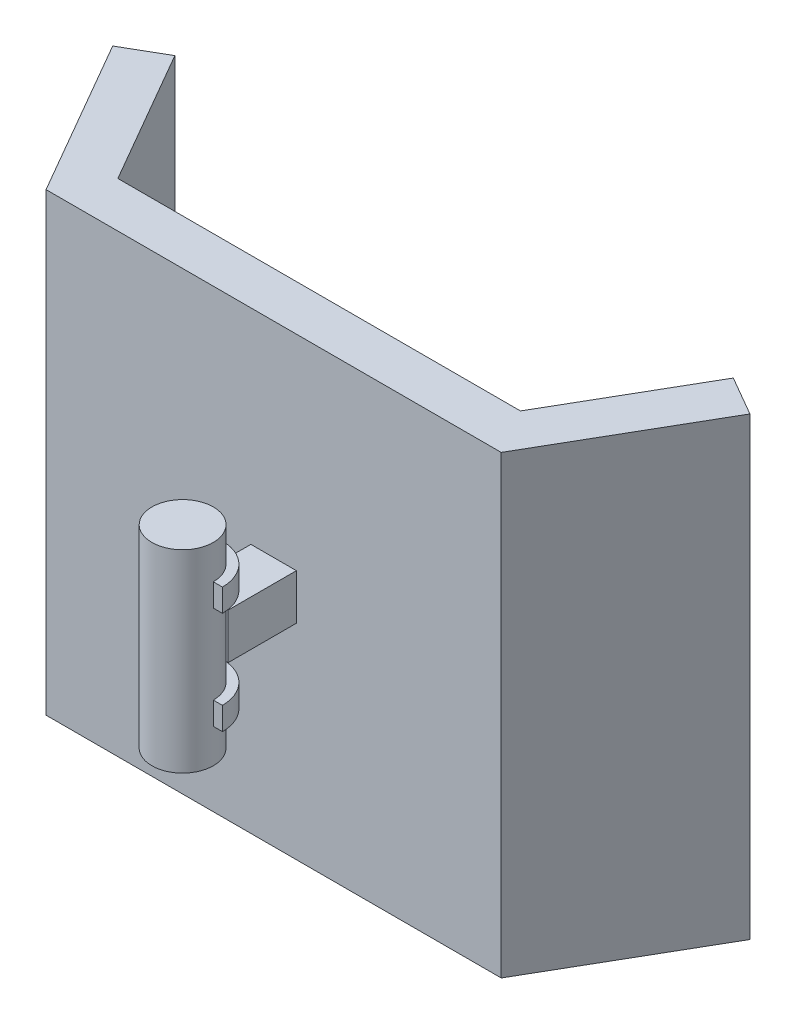
ISO-10303-21;
HEADER;
FILE_DESCRIPTION(('STEP AP214'),'2;1');
FILE_NAME('part.step','',(''),(''),'','','');
FILE_SCHEMA(('AUTOMOTIVE_DESIGN { 1 0 10303 214 1 1 1 1 }'));
ENDSEC;
DATA;
#1=APPLICATION_CONTEXT('core data for automotive mechanical design processes');
#2=APPLICATION_PROTOCOL_DEFINITION('international standard','automotive_design',2000,#1);
#3=PRODUCT_CONTEXT('',#1,'mechanical');
#4=PRODUCT('Part','Part','',(#3));
#5=PRODUCT_RELATED_PRODUCT_CATEGORY('part','',(#4));
#6=PRODUCT_DEFINITION_FORMATION('','',#4);
#7=PRODUCT_DEFINITION_CONTEXT('part definition',#1,'design');
#8=PRODUCT_DEFINITION('design','',#6,#7);
#9=PRODUCT_DEFINITION_SHAPE('','',#8);
#10=(LENGTH_UNIT() NAMED_UNIT(*) SI_UNIT(.MILLI.,.METRE.));
#11=(NAMED_UNIT(*) PLANE_ANGLE_UNIT() SI_UNIT($,.RADIAN.));
#12=(NAMED_UNIT(*) SI_UNIT($,.STERADIAN.) SOLID_ANGLE_UNIT());
#13=UNCERTAINTY_MEASURE_WITH_UNIT(LENGTH_MEASURE(1.E-05),#10,'distance_accuracy_value','');
#14=(GEOMETRIC_REPRESENTATION_CONTEXT(3) GLOBAL_UNCERTAINTY_ASSIGNED_CONTEXT((#13)) GLOBAL_UNIT_ASSIGNED_CONTEXT((#10,
#11,#12)) REPRESENTATION_CONTEXT('',''));
#15=CARTESIAN_POINT('',(0.,0.,0.));
#16=DIRECTION('',(0.,0.,1.));
#17=DIRECTION('',(1.,0.,0.));
#18=AXIS2_PLACEMENT_3D('',#15,#16,#17);
#19=CARTESIAN_POINT('',(0.,-4.25,4.));
#20=DIRECTION('',(0.,1.,0.));
#21=DIRECTION('',(0.,0.,1.));
#22=AXIS2_PLACEMENT_3D('',#19,#20,#21);
#23=CYLINDRICAL_SURFACE('',#22,1.35);
#24=CARTESIAN_POINT('',(0.,4.25,4.));
#25=DIRECTION('',(0.,1.,0.));
#26=DIRECTION('',(0.,0.,1.));
#27=AXIS2_PLACEMENT_3D('',#24,#25,#26);
#28=CIRCLE('',#27,1.35);
#29=CARTESIAN_POINT('',(0.,4.25,5.35));
#30=VERTEX_POINT('',#29);
#31=EDGE_CURVE('E296',#30,#30,#28,.T.);
#32=ORIENTED_EDGE('',*,*,#31,.F.);
#33=EDGE_LOOP('',(#32));
#34=FACE_BOUND('',#33,.T.);
#35=CARTESIAN_POINT('',(0.,-4.25,4.));
#36=DIRECTION('',(0.,1.,0.));
#37=DIRECTION('',(0.,0.,1.));
#38=AXIS2_PLACEMENT_3D('',#35,#36,#37);
#39=CIRCLE('',#38,1.35);
#40=CARTESIAN_POINT('',(0.,-4.25,5.35));
#41=VERTEX_POINT('',#40);
#42=EDGE_CURVE('E305',#41,#41,#39,.T.);
#43=ORIENTED_EDGE('',*,*,#42,.T.);
#44=EDGE_LOOP('',(#43));
#45=FACE_BOUND('',#44,.T.);
#46=DIRECTION('',(0.,1.,0.));
#47=VECTOR('',#46,1.);
#48=CARTESIAN_POINT('',(-0.906917857360853,-4.25,3.));
#49=LINE('',#48,#47);
#50=CARTESIAN_POINT('',(-0.906917857360853,-1.,3.));
#51=VERTEX_POINT('',#50);
#52=CARTESIAN_POINT('',(-0.906917857360853,0.999999999999999,3.));
#53=VERTEX_POINT('',#52);
#54=EDGE_CURVE('E351',#51,#53,#49,.T.);
#55=ORIENTED_EDGE('',*,*,#54,.F.);
#56=CARTESIAN_POINT('',(0.,-1.,4.));
#57=DIRECTION('',(0.,1.,0.));
#58=DIRECTION('',(0.,0.,1.));
#59=AXIS2_PLACEMENT_3D('',#56,#57,#58);
#60=CIRCLE('',#59,1.35);
#61=CARTESIAN_POINT('',(0.906917857360853,-1.,3.));
#62=VERTEX_POINT('',#61);
#63=EDGE_CURVE('E304',#62,#51,#60,.T.);
#64=ORIENTED_EDGE('',*,*,#63,.F.);
#65=DIRECTION('',(0.,1.,0.));
#66=VECTOR('',#65,1.);
#67=CARTESIAN_POINT('',(0.906917857360853,-4.25,3.));
#68=LINE('',#67,#66);
#69=CARTESIAN_POINT('',(0.906917857360853,0.999999999999999,3.));
#70=VERTEX_POINT('',#69);
#71=EDGE_CURVE('E347',#70,#62,#68,.F.);
#72=ORIENTED_EDGE('',*,*,#71,.F.);
#73=CARTESIAN_POINT('',(0.,0.999999999999999,4.));
#74=DIRECTION('',(0.,-1.,0.));
#75=DIRECTION('',(0.,0.,-1.));
#76=AXIS2_PLACEMENT_3D('',#73,#74,#75);
#77=CIRCLE('',#76,1.35);
#78=EDGE_CURVE('E308',#53,#70,#77,.T.);
#79=ORIENTED_EDGE('',*,*,#78,.F.);
#80=EDGE_LOOP('',(#55,#64,#72,#79));
#81=FACE_BOUND('',#80,.T.);
#82=DIRECTION('',(0.,1.,0.));
#83=VECTOR('',#82,1.);
#84=CARTESIAN_POINT('',(1.35,-4.25,4.));
#85=LINE('',#84,#83);
#86=CARTESIAN_POINT('',(1.35,-1.75,4.));
#87=VERTEX_POINT('',#86);
#88=CARTESIAN_POINT('',(1.35,-2.75,4.));
#89=VERTEX_POINT('',#88);
#90=EDGE_CURVE('E359',#87,#89,#85,.F.);
#91=ORIENTED_EDGE('',*,*,#90,.F.);
#92=CARTESIAN_POINT('',(0.,-1.75,4.));
#93=DIRECTION('',(0.,-1.,0.));
#94=DIRECTION('',(0.,0.,-1.));
#95=AXIS2_PLACEMENT_3D('',#92,#93,#94);
#96=CIRCLE('',#95,1.35);
#97=CARTESIAN_POINT('',(-1.35,-1.75,4.));
#98=VERTEX_POINT('',#97);
#99=EDGE_CURVE('E361',#87,#98,#96,.F.);
#100=ORIENTED_EDGE('',*,*,#99,.T.);
#101=DIRECTION('',(0.,1.,0.));
#102=VECTOR('',#101,1.);
#103=CARTESIAN_POINT('',(-1.35,-4.25,4.));
#104=LINE('',#103,#102);
#105=CARTESIAN_POINT('',(-1.35,-2.75,4.));
#106=VERTEX_POINT('',#105);
#107=EDGE_CURVE('E357',#106,#98,#104,.T.);
#108=ORIENTED_EDGE('',*,*,#107,.F.);
#109=CARTESIAN_POINT('',(0.,-2.75,4.));
#110=DIRECTION('',(0.,-1.,0.));
#111=DIRECTION('',(0.,0.,-1.));
#112=AXIS2_PLACEMENT_3D('',#109,#110,#111);
#113=CIRCLE('',#112,1.35);
#114=EDGE_CURVE('E353',#89,#106,#113,.F.);
#115=ORIENTED_EDGE('',*,*,#114,.F.);
#116=EDGE_LOOP('',(#91,#100,#108,#115));
#117=FACE_BOUND('',#116,.T.);
#118=DIRECTION('',(0.,1.,0.));
#119=VECTOR('',#118,1.);
#120=CARTESIAN_POINT('',(-1.35,-4.25,4.));
#121=LINE('',#120,#119);
#122=CARTESIAN_POINT('',(-1.35,1.75,4.));
#123=VERTEX_POINT('',#122);
#124=CARTESIAN_POINT('',(-1.35,2.75,4.));
#125=VERTEX_POINT('',#124);
#126=EDGE_CURVE('E56',#123,#125,#121,.T.);
#127=ORIENTED_EDGE('',*,*,#126,.F.);
#128=CARTESIAN_POINT('',(0.,1.75,4.));
#129=DIRECTION('',(0.,1.,0.));
#130=DIRECTION('',(0.,0.,1.));
#131=AXIS2_PLACEMENT_3D('',#128,#129,#130);
#132=CIRCLE('',#131,1.35);
#133=CARTESIAN_POINT('',(1.35,1.75,4.));
#134=VERTEX_POINT('',#133);
#135=EDGE_CURVE('E11',#123,#134,#132,.F.);
#136=ORIENTED_EDGE('',*,*,#135,.T.);
#137=DIRECTION('',(0.,1.,0.));
#138=VECTOR('',#137,1.);
#139=CARTESIAN_POINT('',(1.35,-4.25,4.));
#140=LINE('',#139,#138);
#141=CARTESIAN_POINT('',(1.35,2.75,4.));
#142=VERTEX_POINT('',#141);
#143=EDGE_CURVE('E47',#142,#134,#140,.F.);
#144=ORIENTED_EDGE('',*,*,#143,.F.);
#145=CARTESIAN_POINT('',(0.,2.75,4.));
#146=DIRECTION('',(0.,1.,0.));
#147=DIRECTION('',(0.,0.,1.));
#148=AXIS2_PLACEMENT_3D('',#145,#146,#147);
#149=CIRCLE('',#148,1.35);
#150=EDGE_CURVE('E362',#125,#142,#149,.F.);
#151=ORIENTED_EDGE('',*,*,#150,.F.);
#152=EDGE_LOOP('',(#127,#136,#144,#151));
#153=FACE_BOUND('',#152,.T.);
#154=ADVANCED_FACE('F41',(#34,#45,#81,#117,#153),#23,.T.);
#155=CARTESIAN_POINT('',(0.,0.,3.));
#156=DIRECTION('',(0.,0.,-1.));
#157=DIRECTION('',(-1.,0.,0.));
#158=AXIS2_PLACEMENT_3D('',#155,#156,#157);
#159=PLANE('',#158);
#160=DIRECTION('',(1.,0.,0.));
#161=VECTOR('',#160,1.);
#162=CARTESIAN_POINT('',(-1.,-1.,3.));
#163=LINE('',#162,#161);
#164=CARTESIAN_POINT('',(-1.,-1.,3.));
#165=VERTEX_POINT('',#164);
#166=EDGE_CURVE('E324',#165,#51,#163,.T.);
#167=ORIENTED_EDGE('',*,*,#166,.T.);
#168=ORIENTED_EDGE('',*,*,#54,.T.);
#169=DIRECTION('',(-1.,0.,0.));
#170=VECTOR('',#169,1.);
#171=CARTESIAN_POINT('',(-1.,0.999999999999999,3.));
#172=LINE('',#171,#170);
#173=CARTESIAN_POINT('',(-1.,0.999999999999999,3.));
#174=VERTEX_POINT('',#173);
#175=EDGE_CURVE('E314',#53,#174,#172,.T.);
#176=ORIENTED_EDGE('',*,*,#175,.T.);
#177=DIRECTION('',(0.,-1.,0.));
#178=VECTOR('',#177,1.);
#179=CARTESIAN_POINT('',(-1.,-1.,3.));
#180=LINE('',#179,#178);
#181=EDGE_CURVE('E318',#174,#165,#180,.T.);
#182=ORIENTED_EDGE('',*,*,#181,.T.);
#183=EDGE_LOOP('',(#167,#168,#176,#182));
#184=FACE_BOUND('',#183,.T.);
#185=ADVANCED_FACE('F400',(#184),#159,.F.);
#186=CARTESIAN_POINT('',(0.999999999999999,-1.,3.));
#187=DIRECTION('',(-1.,0.,0.));
#188=DIRECTION('',(0.,0.,1.));
#189=AXIS2_PLACEMENT_3D('',#186,#187,#188);
#190=PLANE('',#189);
#191=DIRECTION('',(0.,1.,0.));
#192=VECTOR('',#191,1.);
#193=CARTESIAN_POINT('',(0.999999999999999,-1.,0.));
#194=LINE('',#193,#192);
#195=CARTESIAN_POINT('',(0.999999999999999,-1.,0.));
#196=VERTEX_POINT('',#195);
#197=CARTESIAN_POINT('',(0.999999999999999,0.999999999999999,0.));
#198=VERTEX_POINT('',#197);
#199=EDGE_CURVE('E311',#196,#198,#194,.T.);
#200=ORIENTED_EDGE('',*,*,#199,.T.);
#201=DIRECTION('',(0.,0.,-1.));
#202=VECTOR('',#201,1.);
#203=CARTESIAN_POINT('',(0.999999999999999,0.999999999999999,3.));
#204=LINE('',#203,#202);
#205=CARTESIAN_POINT('',(0.999999999999999,0.999999999999999,3.));
#206=VERTEX_POINT('',#205);
#207=EDGE_CURVE('E345',#206,#198,#204,.T.);
#208=ORIENTED_EDGE('',*,*,#207,.F.);
#209=DIRECTION('',(0.,1.,0.));
#210=VECTOR('',#209,1.);
#211=CARTESIAN_POINT('',(0.999999999999999,-1.,3.));
#212=LINE('',#211,#210);
#213=CARTESIAN_POINT('',(0.999999999999999,-1.,3.));
#214=VERTEX_POINT('',#213);
#215=EDGE_CURVE('E315',#214,#206,#212,.T.);
#216=ORIENTED_EDGE('',*,*,#215,.F.);
#217=DIRECTION('',(0.,0.,-1.));
#218=VECTOR('',#217,1.);
#219=CARTESIAN_POINT('',(0.999999999999999,-1.,3.));
#220=LINE('',#219,#218);
#221=EDGE_CURVE('E328',#214,#196,#220,.T.);
#222=ORIENTED_EDGE('',*,*,#221,.T.);
#223=EDGE_LOOP('',(#200,#208,#216,#222));
#224=FACE_BOUND('',#223,.T.);
#225=ADVANCED_FACE('F43',(#224),#190,.F.);
#226=CARTESIAN_POINT('',(-1.,0.999999999999999,3.));
#227=DIRECTION('',(0.,-1.,0.));
#228=DIRECTION('',(0.,0.,-1.));
#229=AXIS2_PLACEMENT_3D('',#226,#227,#228);
#230=PLANE('',#229);
#231=ORIENTED_EDGE('',*,*,#175,.F.);
#232=ORIENTED_EDGE('',*,*,#78,.T.);
#233=EDGE_CURVE('E320',#206,#70,#172,.T.);
#234=ORIENTED_EDGE('',*,*,#233,.F.);
#235=ORIENTED_EDGE('',*,*,#207,.T.);
#236=DIRECTION('',(-1.,0.,0.));
#237=VECTOR('',#236,1.);
#238=CARTESIAN_POINT('',(-1.,0.999999999999999,0.));
#239=LINE('',#238,#237);
#240=CARTESIAN_POINT('',(-1.,0.999999999999999,0.));
#241=VERTEX_POINT('',#240);
#242=EDGE_CURVE('E330',#198,#241,#239,.T.);
#243=ORIENTED_EDGE('',*,*,#242,.T.);
#244=DIRECTION('',(0.,0.,-1.));
#245=VECTOR('',#244,1.);
#246=CARTESIAN_POINT('',(-1.,0.999999999999999,3.));
#247=LINE('',#246,#245);
#248=EDGE_CURVE('E342',#174,#241,#247,.T.);
#249=ORIENTED_EDGE('',*,*,#248,.F.);
#250=EDGE_LOOP('',(#231,#232,#234,#235,#243,#249));
#251=FACE_BOUND('',#250,.T.);
#252=ADVANCED_FACE('F423',(#251),#230,.F.);
#253=CARTESIAN_POINT('',(-1.,-1.,3.));
#254=DIRECTION('',(1.,0.,0.));
#255=DIRECTION('',(0.,0.,-1.));
#256=AXIS2_PLACEMENT_3D('',#253,#254,#255);
#257=PLANE('',#256);
#258=DIRECTION('',(0.,-1.,0.));
#259=VECTOR('',#258,1.);
#260=CARTESIAN_POINT('',(-1.,-1.,0.));
#261=LINE('',#260,#259);
#262=CARTESIAN_POINT('',(-1.,-1.,0.));
#263=VERTEX_POINT('',#262);
#264=EDGE_CURVE('E335',#241,#263,#261,.T.);
#265=ORIENTED_EDGE('',*,*,#264,.T.);
#266=DIRECTION('',(0.,0.,-1.));
#267=VECTOR('',#266,1.);
#268=CARTESIAN_POINT('',(-1.,-1.,3.));
#269=LINE('',#268,#267);
#270=EDGE_CURVE('E339',#165,#263,#269,.T.);
#271=ORIENTED_EDGE('',*,*,#270,.F.);
#272=ORIENTED_EDGE('',*,*,#181,.F.);
#273=ORIENTED_EDGE('',*,*,#248,.T.);
#274=EDGE_LOOP('',(#265,#271,#272,#273));
#275=FACE_BOUND('',#274,.T.);
#276=ADVANCED_FACE('F417',(#275),#257,.F.);
#277=CARTESIAN_POINT('',(-1.,-1.,3.));
#278=DIRECTION('',(0.,1.,0.));
#279=DIRECTION('',(0.,0.,1.));
#280=AXIS2_PLACEMENT_3D('',#277,#278,#279);
#281=PLANE('',#280);
#282=EDGE_CURVE('E322',#62,#214,#163,.T.);
#283=ORIENTED_EDGE('',*,*,#282,.F.);
#284=ORIENTED_EDGE('',*,*,#63,.T.);
#285=ORIENTED_EDGE('',*,*,#166,.F.);
#286=ORIENTED_EDGE('',*,*,#270,.T.);
#287=DIRECTION('',(1.,0.,0.));
#288=VECTOR('',#287,1.);
#289=CARTESIAN_POINT('',(-1.,-1.,0.));
#290=LINE('',#289,#288);
#291=EDGE_CURVE('E317',#263,#196,#290,.T.);
#292=ORIENTED_EDGE('',*,*,#291,.T.);
#293=ORIENTED_EDGE('',*,*,#221,.F.);
#294=EDGE_LOOP('',(#283,#284,#285,#286,#292,#293));
#295=FACE_BOUND('',#294,.T.);
#296=ADVANCED_FACE('F415',(#295),#281,.F.);
#297=ORIENTED_EDGE('',*,*,#233,.T.);
#298=ORIENTED_EDGE('',*,*,#71,.T.);
#299=ORIENTED_EDGE('',*,*,#282,.T.);
#300=ORIENTED_EDGE('',*,*,#215,.T.);
#301=EDGE_LOOP('',(#297,#298,#299,#300));
#302=FACE_BOUND('',#301,.T.);
#303=ADVANCED_FACE('F406',(#302),#159,.F.);
#304=CARTESIAN_POINT('',(0.,-4.25,4.));
#305=DIRECTION('',(0.,1.,0.));
#306=DIRECTION('',(0.,0.,1.));
#307=AXIS2_PLACEMENT_3D('',#304,#305,#306);
#308=PLANE('',#307);
#309=ORIENTED_EDGE('',*,*,#42,.F.);
#310=EDGE_LOOP('',(#309));
#311=FACE_BOUND('',#310,.T.);
#312=ADVANCED_FACE('F410',(#311),#308,.F.);
#313=CARTESIAN_POINT('',(0.,4.25,4.));
#314=DIRECTION('',(0.,1.,0.));
#315=DIRECTION('',(0.,0.,1.));
#316=AXIS2_PLACEMENT_3D('',#313,#314,#315);
#317=PLANE('',#316);
#318=ORIENTED_EDGE('',*,*,#31,.T.);
#319=EDGE_LOOP('',(#318));
#320=FACE_BOUND('',#319,.T.);
#321=ADVANCED_FACE('F603',(#320),#317,.T.);
#322=CARTESIAN_POINT('',(1.75,-1.75,4.));
#323=DIRECTION('',(0.,0.,1.));
#324=DIRECTION('',(1.,0.,0.));
#325=AXIS2_PLACEMENT_3D('',#322,#323,#324);
#326=PLANE('',#325);
#327=DIRECTION('',(-1.,0.,0.));
#328=VECTOR('',#327,1.);
#329=CARTESIAN_POINT('',(1.75,-1.75,4.));
#330=LINE('',#329,#328);
#331=CARTESIAN_POINT('',(1.75,-1.75,4.));
#332=VERTEX_POINT('',#331);
#333=EDGE_CURVE('E286',#332,#87,#330,.T.);
#334=ORIENTED_EDGE('',*,*,#333,.T.);
#335=ORIENTED_EDGE('',*,*,#90,.T.);
#336=DIRECTION('',(-1.,0.,0.));
#337=VECTOR('',#336,1.);
#338=CARTESIAN_POINT('',(1.75,-2.75,4.));
#339=LINE('',#338,#337);
#340=CARTESIAN_POINT('',(1.75,-2.75,4.));
#341=VERTEX_POINT('',#340);
#342=EDGE_CURVE('E281',#341,#89,#339,.T.);
#343=ORIENTED_EDGE('',*,*,#342,.F.);
#344=DIRECTION('',(0.,-1.,0.));
#345=VECTOR('',#344,1.);
#346=CARTESIAN_POINT('',(1.75,-1.75,4.));
#347=LINE('',#346,#345);
#348=EDGE_CURVE('E288',#332,#341,#347,.T.);
#349=ORIENTED_EDGE('',*,*,#348,.F.);
#350=EDGE_LOOP('',(#334,#335,#343,#349));
#351=FACE_BOUND('',#350,.T.);
#352=ADVANCED_FACE('F589',(#351),#326,.T.);
#353=CARTESIAN_POINT('',(0.,-1.75,4.));
#354=DIRECTION('',(0.,-1.,0.));
#355=DIRECTION('',(0.,0.,-1.));
#356=AXIS2_PLACEMENT_3D('',#353,#354,#355);
#357=CYLINDRICAL_SURFACE('',#356,1.75);
#358=CARTESIAN_POINT('',(0.,-2.75,4.));
#359=DIRECTION('',(0.,-1.,0.));
#360=DIRECTION('',(0.,0.,-1.));
#361=AXIS2_PLACEMENT_3D('',#358,#359,#360);
#362=CIRCLE('',#361,1.75);
#363=CARTESIAN_POINT('',(-1.75,-2.75,4.));
#364=VERTEX_POINT('',#363);
#365=EDGE_CURVE('E278',#364,#341,#362,.T.);
#366=ORIENTED_EDGE('',*,*,#365,.F.);
#367=DIRECTION('',(0.,-1.,0.));
#368=VECTOR('',#367,1.);
#369=CARTESIAN_POINT('',(-1.75,-1.75,4.));
#370=LINE('',#369,#368);
#371=CARTESIAN_POINT('',(-1.75,-1.75,4.));
#372=VERTEX_POINT('',#371);
#373=EDGE_CURVE('E294',#372,#364,#370,.T.);
#374=ORIENTED_EDGE('',*,*,#373,.F.);
#375=CARTESIAN_POINT('',(0.,-1.75,4.));
#376=DIRECTION('',(0.,-1.,0.));
#377=DIRECTION('',(0.,0.,-1.));
#378=AXIS2_PLACEMENT_3D('',#375,#376,#377);
#379=CIRCLE('',#378,1.75);
#380=EDGE_CURVE('E283',#372,#332,#379,.T.);
#381=ORIENTED_EDGE('',*,*,#380,.T.);
#382=ORIENTED_EDGE('',*,*,#348,.T.);
#383=EDGE_LOOP('',(#366,#374,#381,#382));
#384=FACE_BOUND('',#383,.T.);
#385=ADVANCED_FACE('F583',(#384),#357,.T.);
#386=EDGE_CURVE('E292',#106,#364,#339,.T.);
#387=ORIENTED_EDGE('',*,*,#386,.F.);
#388=ORIENTED_EDGE('',*,*,#107,.T.);
#389=EDGE_CURVE('E285',#98,#372,#330,.T.);
#390=ORIENTED_EDGE('',*,*,#389,.T.);
#391=ORIENTED_EDGE('',*,*,#373,.T.);
#392=EDGE_LOOP('',(#387,#388,#390,#391));
#393=FACE_BOUND('',#392,.T.);
#394=ADVANCED_FACE('F573',(#393),#326,.T.);
#395=CARTESIAN_POINT('',(0.,-1.75,4.));
#396=DIRECTION('',(0.,-1.,0.));
#397=DIRECTION('',(0.,0.,-1.));
#398=AXIS2_PLACEMENT_3D('',#395,#396,#397);
#399=PLANE('',#398);
#400=ORIENTED_EDGE('',*,*,#99,.F.);
#401=ORIENTED_EDGE('',*,*,#333,.F.);
#402=ORIENTED_EDGE('',*,*,#380,.F.);
#403=ORIENTED_EDGE('',*,*,#389,.F.);
#404=EDGE_LOOP('',(#400,#401,#402,#403));
#405=FACE_BOUND('',#404,.T.);
#406=ADVANCED_FACE('F562',(#405),#399,.F.);
#407=CARTESIAN_POINT('',(0.,-2.75,4.));
#408=DIRECTION('',(0.,-1.,0.));
#409=DIRECTION('',(0.,0.,-1.));
#410=AXIS2_PLACEMENT_3D('',#407,#408,#409);
#411=PLANE('',#410);
#412=ORIENTED_EDGE('',*,*,#342,.T.);
#413=ORIENTED_EDGE('',*,*,#114,.T.);
#414=ORIENTED_EDGE('',*,*,#386,.T.);
#415=ORIENTED_EDGE('',*,*,#365,.T.);
#416=EDGE_LOOP('',(#412,#413,#414,#415));
#417=FACE_BOUND('',#416,.T.);
#418=ADVANCED_FACE('F391',(#417),#411,.T.);
#419=CARTESIAN_POINT('',(1.75,1.75,4.));
#420=DIRECTION('',(0.,0.,1.));
#421=DIRECTION('',(1.,0.,0.));
#422=AXIS2_PLACEMENT_3D('',#419,#420,#421);
#423=PLANE('',#422);
#424=DIRECTION('',(1.,0.,0.));
#425=VECTOR('',#424,1.);
#426=CARTESIAN_POINT('',(1.75,2.75,4.));
#427=LINE('',#426,#425);
#428=CARTESIAN_POINT('',(1.75,2.75,4.));
#429=VERTEX_POINT('',#428);
#430=EDGE_CURVE('E271',#142,#429,#427,.T.);
#431=ORIENTED_EDGE('',*,*,#430,.F.);
#432=ORIENTED_EDGE('',*,*,#143,.T.);
#433=DIRECTION('',(1.,0.,0.));
#434=VECTOR('',#433,1.);
#435=CARTESIAN_POINT('',(1.75,1.75,4.));
#436=LINE('',#435,#434);
#437=CARTESIAN_POINT('',(1.75,1.75,4.));
#438=VERTEX_POINT('',#437);
#439=EDGE_CURVE('E261',#134,#438,#436,.T.);
#440=ORIENTED_EDGE('',*,*,#439,.T.);
#441=DIRECTION('',(0.,1.,0.));
#442=VECTOR('',#441,1.);
#443=CARTESIAN_POINT('',(1.75,1.75,4.));
#444=LINE('',#443,#442);
#445=EDGE_CURVE('E276',#438,#429,#444,.T.);
#446=ORIENTED_EDGE('',*,*,#445,.T.);
#447=EDGE_LOOP('',(#431,#432,#440,#446));
#448=FACE_BOUND('',#447,.T.);
#449=ADVANCED_FACE('F371',(#448),#423,.T.);
#450=CARTESIAN_POINT('',(0.,1.75,4.));
#451=DIRECTION('',(0.,1.,0.));
#452=DIRECTION('',(0.,0.,1.));
#453=AXIS2_PLACEMENT_3D('',#450,#451,#452);
#454=CYLINDRICAL_SURFACE('',#453,1.75);
#455=CARTESIAN_POINT('',(0.,2.75,4.));
#456=DIRECTION('',(0.,1.,0.));
#457=DIRECTION('',(0.,0.,1.));
#458=AXIS2_PLACEMENT_3D('',#455,#456,#457);
#459=CIRCLE('',#458,1.75);
#460=CARTESIAN_POINT('',(-1.75,2.75,4.));
#461=VERTEX_POINT('',#460);
#462=EDGE_CURVE('E249',#429,#461,#459,.T.);
#463=ORIENTED_EDGE('',*,*,#462,.F.);
#464=ORIENTED_EDGE('',*,*,#445,.F.);
#465=CARTESIAN_POINT('',(0.,1.75,4.));
#466=DIRECTION('',(0.,1.,0.));
#467=DIRECTION('',(0.,0.,1.));
#468=AXIS2_PLACEMENT_3D('',#465,#466,#467);
#469=CIRCLE('',#468,1.75);
#470=CARTESIAN_POINT('',(-1.75,1.75,4.));
#471=VERTEX_POINT('',#470);
#472=EDGE_CURVE('E264',#438,#471,#469,.T.);
#473=ORIENTED_EDGE('',*,*,#472,.T.);
#474=DIRECTION('',(0.,1.,0.));
#475=VECTOR('',#474,1.);
#476=CARTESIAN_POINT('',(-1.75,1.75,4.));
#477=LINE('',#476,#475);
#478=EDGE_CURVE('E269',#471,#461,#477,.T.);
#479=ORIENTED_EDGE('',*,*,#478,.T.);
#480=EDGE_LOOP('',(#463,#464,#473,#479));
#481=FACE_BOUND('',#480,.T.);
#482=ADVANCED_FACE('F378',(#481),#454,.T.);
#483=EDGE_CURVE('E270',#471,#123,#436,.T.);
#484=ORIENTED_EDGE('',*,*,#483,.T.);
#485=ORIENTED_EDGE('',*,*,#126,.T.);
#486=EDGE_CURVE('E266',#461,#125,#427,.T.);
#487=ORIENTED_EDGE('',*,*,#486,.F.);
#488=ORIENTED_EDGE('',*,*,#478,.F.);
#489=EDGE_LOOP('',(#484,#485,#487,#488));
#490=FACE_BOUND('',#489,.T.);
#491=ADVANCED_FACE('F381',(#490),#423,.T.);
#492=CARTESIAN_POINT('',(0.,1.75,4.));
#493=DIRECTION('',(0.,1.,0.));
#494=DIRECTION('',(0.,0.,1.));
#495=AXIS2_PLACEMENT_3D('',#492,#493,#494);
#496=PLANE('',#495);
#497=ORIENTED_EDGE('',*,*,#135,.F.);
#498=ORIENTED_EDGE('',*,*,#483,.F.);
#499=ORIENTED_EDGE('',*,*,#472,.F.);
#500=ORIENTED_EDGE('',*,*,#439,.F.);
#501=EDGE_LOOP('',(#497,#498,#499,#500));
#502=FACE_BOUND('',#501,.T.);
#503=ADVANCED_FACE('F374',(#502),#496,.F.);
#504=CARTESIAN_POINT('',(0.,2.75,4.));
#505=DIRECTION('',(0.,1.,0.));
#506=DIRECTION('',(0.,0.,1.));
#507=AXIS2_PLACEMENT_3D('',#504,#505,#506);
#508=PLANE('',#507);
#509=ORIENTED_EDGE('',*,*,#486,.T.);
#510=ORIENTED_EDGE('',*,*,#150,.T.);
#511=ORIENTED_EDGE('',*,*,#430,.T.);
#512=ORIENTED_EDGE('',*,*,#462,.T.);
#513=EDGE_LOOP('',(#509,#510,#511,#512));
#514=FACE_BOUND('',#513,.T.);
#515=ADVANCED_FACE('F385',(#514),#508,.T.);
#516=CARTESIAN_POINT('',(10.,-10.,0.));
#517=DIRECTION('',(0.,0.,1.));
#518=DIRECTION('',(1.,0.,0.));
#519=AXIS2_PLACEMENT_3D('',#516,#517,#518);
#520=PLANE('',#519);
#521=DIRECTION('',(0.,1.,0.));
#522=VECTOR('',#521,1.);
#523=CARTESIAN_POINT('',(10.,-10.,0.));
#524=LINE('',#523,#522);
#525=CARTESIAN_POINT('',(10.,-10.,0.));
#526=VERTEX_POINT('',#525);
#527=CARTESIAN_POINT('',(10.,10.,0.));
#528=VERTEX_POINT('',#527);
#529=EDGE_CURVE('E198',#526,#528,#524,.T.);
#530=ORIENTED_EDGE('',*,*,#529,.T.);
#531=DIRECTION('',(1.,0.,0.));
#532=VECTOR('',#531,1.);
#533=CARTESIAN_POINT('',(10.,10.,0.));
#534=LINE('',#533,#532);
#535=CARTESIAN_POINT('',(-10.,10.,0.));
#536=VERTEX_POINT('',#535);
#537=EDGE_CURVE('E196',#536,#528,#534,.T.);
#538=ORIENTED_EDGE('',*,*,#537,.F.);
#539=DIRECTION('',(0.,1.,0.));
#540=VECTOR('',#539,1.);
#541=CARTESIAN_POINT('',(-10.,-10.,0.));
#542=LINE('',#541,#540);
#543=CARTESIAN_POINT('',(-10.,-10.,0.));
#544=VERTEX_POINT('',#543);
#545=EDGE_CURVE('E187',#544,#536,#542,.T.);
#546=ORIENTED_EDGE('',*,*,#545,.F.);
#547=DIRECTION('',(1.,0.,0.));
#548=VECTOR('',#547,1.);
#549=CARTESIAN_POINT('',(10.,-10.,0.));
#550=LINE('',#549,#548);
#551=EDGE_CURVE('E230',#544,#526,#550,.T.);
#552=ORIENTED_EDGE('',*,*,#551,.T.);
#553=EDGE_LOOP('',(#530,#538,#546,#552));
#554=FACE_BOUND('',#553,.T.);
#555=ORIENTED_EDGE('',*,*,#199,.F.);
#556=ORIENTED_EDGE('',*,*,#291,.F.);
#557=ORIENTED_EDGE('',*,*,#264,.F.);
#558=ORIENTED_EDGE('',*,*,#242,.F.);
#559=EDGE_LOOP('',(#555,#556,#557,#558));
#560=FACE_BOUND('',#559,.T.);
#561=ADVANCED_FACE('F201',(#554,#560),#520,.T.);
#562=CARTESIAN_POINT('',(-10.,-10.,0.));
#563=DIRECTION('',(-0.86602540378444,0.,0.499999999999998));
#564=DIRECTION('',(0.499999999999998,0.,0.86602540378444));
#565=AXIS2_PLACEMENT_3D('',#562,#563,#564);
#566=PLANE('',#565);
#567=ORIENTED_EDGE('',*,*,#545,.T.);
#568=DIRECTION('',(0.499999999999998,0.,0.86602540378444));
#569=VECTOR('',#568,1.);
#570=CARTESIAN_POINT('',(-10.,10.,0.));
#571=LINE('',#570,#569);
#572=CARTESIAN_POINT('',(-14.,10.,-6.92820323027551));
#573=VERTEX_POINT('',#572);
#574=EDGE_CURVE('E188',#573,#536,#571,.T.);
#575=ORIENTED_EDGE('',*,*,#574,.F.);
#576=DIRECTION('',(0.,1.,0.));
#577=VECTOR('',#576,1.);
#578=CARTESIAN_POINT('',(-14.,-10.,-6.92820323027551));
#579=LINE('',#578,#577);
#580=CARTESIAN_POINT('',(-14.,-10.,-6.92820323027551));
#581=VERTEX_POINT('',#580);
#582=EDGE_CURVE('E247',#581,#573,#579,.T.);
#583=ORIENTED_EDGE('',*,*,#582,.F.);
#584=DIRECTION('',(0.499999999999998,0.,0.86602540378444));
#585=VECTOR('',#584,1.);
#586=CARTESIAN_POINT('',(-10.,-10.,0.));
#587=LINE('',#586,#585);
#588=EDGE_CURVE('E192',#581,#544,#587,.T.);
#589=ORIENTED_EDGE('',*,*,#588,.T.);
#590=EDGE_LOOP('',(#567,#575,#583,#589));
#591=FACE_BOUND('',#590,.T.);
#592=ADVANCED_FACE('F189',(#591),#566,.T.);
#593=CARTESIAN_POINT('',(-14.,-10.,-6.92820323027551));
#594=DIRECTION('',(-0.499999999999998,0.,-0.86602540378444));
#595=DIRECTION('',(-0.86602540378444,0.,0.499999999999998));
#596=AXIS2_PLACEMENT_3D('',#593,#594,#595);
#597=PLANE('',#596);
#598=ORIENTED_EDGE('',*,*,#582,.T.);
#599=DIRECTION('',(-0.86602540378444,0.,0.499999999999998));
#600=VECTOR('',#599,1.);
#601=CARTESIAN_POINT('',(-14.,10.,-6.92820323027551));
#602=LINE('',#601,#600);
#603=CARTESIAN_POINT('',(-12.2679491924311,10.,-7.92820323027551));
#604=VERTEX_POINT('',#603);
#605=EDGE_CURVE('E212',#604,#573,#602,.T.);
#606=ORIENTED_EDGE('',*,*,#605,.F.);
#607=DIRECTION('',(0.,1.,0.));
#608=VECTOR('',#607,1.);
#609=CARTESIAN_POINT('',(-12.2679491924311,-10.,-7.92820323027551));
#610=LINE('',#609,#608);
#611=CARTESIAN_POINT('',(-12.2679491924311,-10.,-7.92820323027551));
#612=VERTEX_POINT('',#611);
#613=EDGE_CURVE('E252',#612,#604,#610,.T.);
#614=ORIENTED_EDGE('',*,*,#613,.F.);
#615=DIRECTION('',(-0.86602540378444,0.,0.499999999999998));
#616=VECTOR('',#615,1.);
#617=CARTESIAN_POINT('',(-14.,-10.,-6.92820323027551));
#618=LINE('',#617,#616);
#619=EDGE_CURVE('E199',#612,#581,#618,.T.);
#620=ORIENTED_EDGE('',*,*,#619,.T.);
#621=EDGE_LOOP('',(#598,#606,#614,#620));
#622=FACE_BOUND('',#621,.T.);
#623=ADVANCED_FACE('F444',(#622),#597,.T.);
#624=CARTESIAN_POINT('',(-12.2679491924311,-10.,-7.92820323027551));
#625=DIRECTION('',(0.86602540378444,0.,-0.499999999999998));
#626=DIRECTION('',(-0.499999999999998,0.,-0.86602540378444));
#627=AXIS2_PLACEMENT_3D('',#624,#625,#626);
#628=PLANE('',#627);
#629=ORIENTED_EDGE('',*,*,#613,.T.);
#630=DIRECTION('',(-0.499999999999998,0.,-0.86602540378444));
#631=VECTOR('',#630,1.);
#632=CARTESIAN_POINT('',(-12.2679491924311,10.,-7.92820323027551));
#633=LINE('',#632,#631);
#634=CARTESIAN_POINT('',(-8.84529946162075,10.,-2.));
#635=VERTEX_POINT('',#634);
#636=EDGE_CURVE('E224',#635,#604,#633,.T.);
#637=ORIENTED_EDGE('',*,*,#636,.F.);
#638=DIRECTION('',(0.,1.,0.));
#639=VECTOR('',#638,1.);
#640=CARTESIAN_POINT('',(-8.84529946162075,-10.,-2.));
#641=LINE('',#640,#639);
#642=CARTESIAN_POINT('',(-8.84529946162075,-10.,-2.));
#643=VERTEX_POINT('',#642);
#644=EDGE_CURVE('E254',#643,#635,#641,.T.);
#645=ORIENTED_EDGE('',*,*,#644,.F.);
#646=DIRECTION('',(-0.499999999999998,0.,-0.86602540378444));
#647=VECTOR('',#646,1.);
#648=CARTESIAN_POINT('',(-12.2679491924311,-10.,-7.92820323027551));
#649=LINE('',#648,#647);
#650=EDGE_CURVE('E243',#643,#612,#649,.T.);
#651=ORIENTED_EDGE('',*,*,#650,.T.);
#652=EDGE_LOOP('',(#629,#637,#645,#651));
#653=FACE_BOUND('',#652,.T.);
#654=ADVANCED_FACE('F464',(#653),#628,.T.);
#655=CARTESIAN_POINT('',(-8.84529946162075,-10.,-2.));
#656=DIRECTION('',(0.,0.,-1.));
#657=DIRECTION('',(-1.,0.,0.));
#658=AXIS2_PLACEMENT_3D('',#655,#656,#657);
#659=PLANE('',#658);
#660=ORIENTED_EDGE('',*,*,#644,.T.);
#661=DIRECTION('',(-1.,0.,0.));
#662=VECTOR('',#661,1.);
#663=CARTESIAN_POINT('',(-8.84529946162075,10.,-2.));
#664=LINE('',#663,#662);
#665=CARTESIAN_POINT('',(8.84529946162075,10.,-2.));
#666=VERTEX_POINT('',#665);
#667=EDGE_CURVE('E225',#666,#635,#664,.T.);
#668=ORIENTED_EDGE('',*,*,#667,.F.);
#669=DIRECTION('',(0.,1.,0.));
#670=VECTOR('',#669,1.);
#671=CARTESIAN_POINT('',(8.84529946162075,-10.,-2.));
#672=LINE('',#671,#670);
#673=CARTESIAN_POINT('',(8.84529946162075,-10.,-2.));
#674=VERTEX_POINT('',#673);
#675=EDGE_CURVE('E253',#674,#666,#672,.T.);
#676=ORIENTED_EDGE('',*,*,#675,.F.);
#677=DIRECTION('',(-1.,0.,0.));
#678=VECTOR('',#677,1.);
#679=CARTESIAN_POINT('',(-8.84529946162075,-10.,-2.));
#680=LINE('',#679,#678);
#681=EDGE_CURVE('E239',#674,#643,#680,.T.);
#682=ORIENTED_EDGE('',*,*,#681,.T.);
#683=EDGE_LOOP('',(#660,#668,#676,#682));
#684=FACE_BOUND('',#683,.T.);
#685=ADVANCED_FACE('F461',(#684),#659,.T.);
#686=CARTESIAN_POINT('',(12.2679491924311,-10.,-7.92820323027551));
#687=DIRECTION('',(-0.86602540378444,0.,-0.499999999999998));
#688=DIRECTION('',(-0.499999999999998,0.,0.86602540378444));
#689=AXIS2_PLACEMENT_3D('',#686,#687,#688);
#690=PLANE('',#689);
#691=ORIENTED_EDGE('',*,*,#675,.T.);
#692=DIRECTION('',(-0.499999999999999,0.,0.86602540378444));
#693=VECTOR('',#692,1.);
#694=CARTESIAN_POINT('',(12.2679491924311,10.,-7.92820323027551));
#695=LINE('',#694,#693);
#696=CARTESIAN_POINT('',(12.2679491924311,10.,-7.92820323027551));
#697=VERTEX_POINT('',#696);
#698=EDGE_CURVE('E220',#697,#666,#695,.T.);
#699=ORIENTED_EDGE('',*,*,#698,.F.);
#700=DIRECTION('',(0.,1.,0.));
#701=VECTOR('',#700,1.);
#702=CARTESIAN_POINT('',(12.2679491924311,-10.,-7.92820323027551));
#703=LINE('',#702,#701);
#704=CARTESIAN_POINT('',(12.2679491924311,-10.,-7.92820323027551));
#705=VERTEX_POINT('',#704);
#706=EDGE_CURVE('E257',#705,#697,#703,.T.);
#707=ORIENTED_EDGE('',*,*,#706,.F.);
#708=DIRECTION('',(-0.499999999999999,0.,0.86602540378444));
#709=VECTOR('',#708,1.);
#710=CARTESIAN_POINT('',(12.2679491924311,-10.,-7.92820323027551));
#711=LINE('',#710,#709);
#712=EDGE_CURVE('E240',#705,#674,#711,.T.);
#713=ORIENTED_EDGE('',*,*,#712,.T.);
#714=EDGE_LOOP('',(#691,#699,#707,#713));
#715=FACE_BOUND('',#714,.T.);
#716=ADVANCED_FACE('F459',(#715),#690,.T.);
#717=CARTESIAN_POINT('',(14.,-10.,-6.92820323027552));
#718=DIRECTION('',(0.499999999999998,0.,-0.86602540378444));
#719=DIRECTION('',(-0.86602540378444,0.,-0.499999999999998));
#720=AXIS2_PLACEMENT_3D('',#717,#718,#719);
#721=PLANE('',#720);
#722=ORIENTED_EDGE('',*,*,#706,.T.);
#723=DIRECTION('',(-0.86602540378444,0.,-0.499999999999998));
#724=VECTOR('',#723,1.);
#725=CARTESIAN_POINT('',(14.,10.,-6.92820323027552));
#726=LINE('',#725,#724);
#727=CARTESIAN_POINT('',(14.,10.,-6.92820323027552));
#728=VERTEX_POINT('',#727);
#729=EDGE_CURVE('E218',#728,#697,#726,.T.);
#730=ORIENTED_EDGE('',*,*,#729,.F.);
#731=DIRECTION('',(0.,1.,0.));
#732=VECTOR('',#731,1.);
#733=CARTESIAN_POINT('',(14.,-10.,-6.92820323027552));
#734=LINE('',#733,#732);
#735=CARTESIAN_POINT('',(14.,-10.,-6.92820323027552));
#736=VERTEX_POINT('',#735);
#737=EDGE_CURVE('E258',#736,#728,#734,.T.);
#738=ORIENTED_EDGE('',*,*,#737,.F.);
#739=DIRECTION('',(-0.86602540378444,0.,-0.499999999999998));
#740=VECTOR('',#739,1.);
#741=CARTESIAN_POINT('',(14.,-10.,-6.92820323027552));
#742=LINE('',#741,#740);
#743=EDGE_CURVE('E234',#736,#705,#742,.T.);
#744=ORIENTED_EDGE('',*,*,#743,.T.);
#745=EDGE_LOOP('',(#722,#730,#738,#744));
#746=FACE_BOUND('',#745,.T.);
#747=ADVANCED_FACE('F454',(#746),#721,.T.);
#748=CARTESIAN_POINT('',(10.,-10.,0.));
#749=DIRECTION('',(0.86602540378444,0.,0.499999999999998));
#750=DIRECTION('',(0.499999999999998,0.,-0.86602540378444));
#751=AXIS2_PLACEMENT_3D('',#748,#749,#750);
#752=PLANE('',#751);
#753=ORIENTED_EDGE('',*,*,#737,.T.);
#754=DIRECTION('',(0.499999999999998,0.,-0.86602540378444));
#755=VECTOR('',#754,1.);
#756=CARTESIAN_POINT('',(10.,10.,0.));
#757=LINE('',#756,#755);
#758=EDGE_CURVE('E207',#528,#728,#757,.T.);
#759=ORIENTED_EDGE('',*,*,#758,.F.);
#760=ORIENTED_EDGE('',*,*,#529,.F.);
#761=DIRECTION('',(0.499999999999998,0.,-0.86602540378444));
#762=VECTOR('',#761,1.);
#763=CARTESIAN_POINT('',(10.,-10.,0.));
#764=LINE('',#763,#762);
#765=EDGE_CURVE('E233',#526,#736,#764,.T.);
#766=ORIENTED_EDGE('',*,*,#765,.T.);
#767=EDGE_LOOP('',(#753,#759,#760,#766));
#768=FACE_BOUND('',#767,.T.);
#769=ADVANCED_FACE('F446',(#768),#752,.T.);
#770=CARTESIAN_POINT('',(0.,-10.,0.));
#771=DIRECTION('',(0.,-1.,0.));
#772=DIRECTION('',(0.,0.,-1.));
#773=AXIS2_PLACEMENT_3D('',#770,#771,#772);
#774=PLANE('',#773);
#775=ORIENTED_EDGE('',*,*,#588,.F.);
#776=ORIENTED_EDGE('',*,*,#619,.F.);
#777=ORIENTED_EDGE('',*,*,#650,.F.);
#778=ORIENTED_EDGE('',*,*,#681,.F.);
#779=ORIENTED_EDGE('',*,*,#712,.F.);
#780=ORIENTED_EDGE('',*,*,#743,.F.);
#781=ORIENTED_EDGE('',*,*,#765,.F.);
#782=ORIENTED_EDGE('',*,*,#551,.F.);
#783=EDGE_LOOP('',(#775,#776,#777,#778,#779,#780,#781,#782));
#784=FACE_BOUND('',#783,.T.);
#785=ADVANCED_FACE('F452',(#784),#774,.T.);
#786=CARTESIAN_POINT('',(0.,10.,0.));
#787=DIRECTION('',(0.,-1.,0.));
#788=DIRECTION('',(0.,0.,-1.));
#789=AXIS2_PLACEMENT_3D('',#786,#787,#788);
#790=PLANE('',#789);
#791=ORIENTED_EDGE('',*,*,#574,.T.);
#792=ORIENTED_EDGE('',*,*,#537,.T.);
#793=ORIENTED_EDGE('',*,*,#758,.T.);
#794=ORIENTED_EDGE('',*,*,#729,.T.);
#795=ORIENTED_EDGE('',*,*,#698,.T.);
#796=ORIENTED_EDGE('',*,*,#667,.T.);
#797=ORIENTED_EDGE('',*,*,#636,.T.);
#798=ORIENTED_EDGE('',*,*,#605,.T.);
#799=EDGE_LOOP('',(#791,#792,#793,#794,#795,#796,#797,#798));
#800=FACE_BOUND('',#799,.T.);
#801=ADVANCED_FACE('F209',(#800),#790,.F.);
#802=CLOSED_SHELL('',(#154,#185,#225,#252,#276,#296,#303,#312,#321,#352,#385,#394,#406,#418,
#449,#482,#491,#503,#515,#561,#592,#623,#654,#685,#716,#747,#769,#785,#801));
#803=MANIFOLD_SOLID_BREP('B2',#802);
#804=ADVANCED_BREP_SHAPE_REPRESENTATION('',(#18,#803),#14);
#805=SHAPE_DEFINITION_REPRESENTATION(#9,#804);
ENDSEC;
END-ISO-10303-21;
